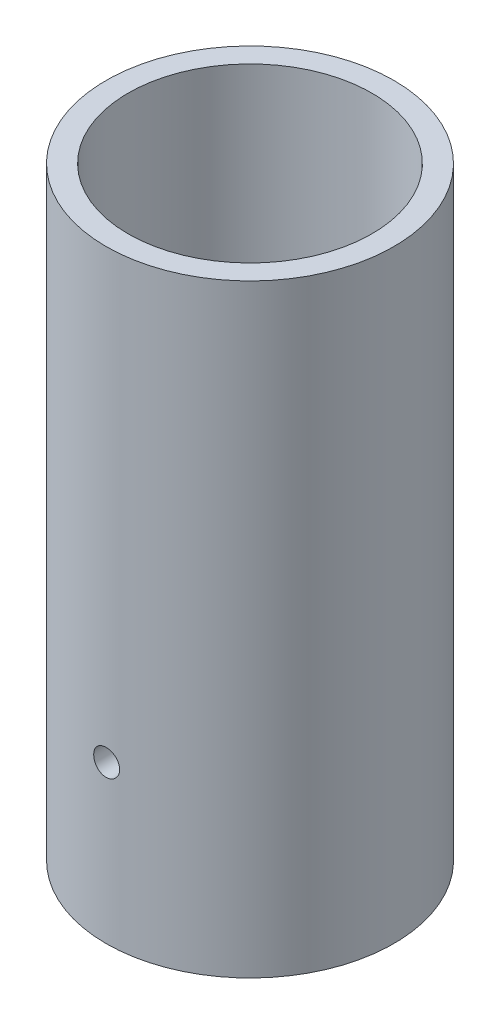
ISO-10303-21;
HEADER;
FILE_DESCRIPTION(('STEP AP214'),'2;1');
FILE_NAME('part.step','',(''),(''),'','','');
FILE_SCHEMA(('AUTOMOTIVE_DESIGN { 1 0 10303 214 1 1 1 1 }'));
ENDSEC;
DATA;
#1=APPLICATION_CONTEXT('core data for automotive mechanical design processes');
#2=APPLICATION_PROTOCOL_DEFINITION('international standard','automotive_design',2000,#1);
#3=PRODUCT_CONTEXT('',#1,'mechanical');
#4=PRODUCT('Part','Part','',(#3));
#5=PRODUCT_RELATED_PRODUCT_CATEGORY('part','',(#4));
#6=PRODUCT_DEFINITION_FORMATION('','',#4);
#7=PRODUCT_DEFINITION_CONTEXT('part definition',#1,'design');
#8=PRODUCT_DEFINITION('design','',#6,#7);
#9=PRODUCT_DEFINITION_SHAPE('','',#8);
#10=(LENGTH_UNIT() NAMED_UNIT(*) SI_UNIT(.MILLI.,.METRE.));
#11=(NAMED_UNIT(*) PLANE_ANGLE_UNIT() SI_UNIT($,.RADIAN.));
#12=(NAMED_UNIT(*) SI_UNIT($,.STERADIAN.) SOLID_ANGLE_UNIT());
#13=UNCERTAINTY_MEASURE_WITH_UNIT(LENGTH_MEASURE(1.E-05),#10,'distance_accuracy_value','');
#14=(GEOMETRIC_REPRESENTATION_CONTEXT(3) GLOBAL_UNCERTAINTY_ASSIGNED_CONTEXT((#13)) GLOBAL_UNIT_ASSIGNED_CONTEXT((#10,
#11,#12)) REPRESENTATION_CONTEXT('',''));
#15=CARTESIAN_POINT('',(0.,0.,0.));
#16=DIRECTION('',(0.,0.,1.));
#17=DIRECTION('',(1.,0.,0.));
#18=AXIS2_PLACEMENT_3D('',#15,#16,#17);
#19=CARTESIAN_POINT('',(0.,127.,0.));
#20=DIRECTION('',(0.,1.,0.));
#21=DIRECTION('',(0.,0.,1.));
#22=AXIS2_PLACEMENT_3D('',#19,#20,#21);
#23=PLANE('',#22);
#24=CARTESIAN_POINT('',(0.,127.,0.));
#25=DIRECTION('',(0.,1.,0.));
#26=DIRECTION('',(0.,0.,1.));
#27=AXIS2_PLACEMENT_3D('',#24,#25,#26);
#28=CIRCLE('',#27,30.275);
#29=CARTESIAN_POINT('',(0.,127.,30.275));
#30=VERTEX_POINT('',#29);
#31=EDGE_CURVE('E10',#30,#30,#28,.T.);
#32=ORIENTED_EDGE('',*,*,#31,.T.);
#33=EDGE_LOOP('',(#32));
#34=FACE_BOUND('',#33,.T.);
#35=CARTESIAN_POINT('',(0.,127.,0.));
#36=DIRECTION('',(0.,1.,0.));
#37=DIRECTION('',(0.,0.,1.));
#38=AXIS2_PLACEMENT_3D('',#35,#36,#37);
#39=CIRCLE('',#38,25.65);
#40=CARTESIAN_POINT('',(0.,127.,25.65));
#41=VERTEX_POINT('',#40);
#42=EDGE_CURVE('E50',#41,#41,#39,.T.);
#43=ORIENTED_EDGE('',*,*,#42,.F.);
#44=EDGE_LOOP('',(#43));
#45=FACE_BOUND('',#44,.T.);
#46=ADVANCED_FACE('F31',(#34,#45),#23,.T.);
#47=CARTESIAN_POINT('',(0.,0.,0.));
#48=DIRECTION('',(0.,1.,0.));
#49=DIRECTION('',(0.,0.,1.));
#50=AXIS2_PLACEMENT_3D('',#47,#48,#49);
#51=PLANE('',#50);
#52=CARTESIAN_POINT('',(0.,0.,0.));
#53=DIRECTION('',(0.,1.,0.));
#54=DIRECTION('',(0.,0.,1.));
#55=AXIS2_PLACEMENT_3D('',#52,#53,#54);
#56=CIRCLE('',#55,30.275);
#57=CARTESIAN_POINT('',(0.,0.,30.275));
#58=VERTEX_POINT('',#57);
#59=EDGE_CURVE('E45',#58,#58,#56,.T.);
#60=ORIENTED_EDGE('',*,*,#59,.F.);
#61=EDGE_LOOP('',(#60));
#62=FACE_BOUND('',#61,.T.);
#63=CARTESIAN_POINT('',(0.,0.,0.));
#64=DIRECTION('',(0.,1.,0.));
#65=DIRECTION('',(0.,0.,1.));
#66=AXIS2_PLACEMENT_3D('',#63,#64,#65);
#67=CIRCLE('',#66,25.65);
#68=CARTESIAN_POINT('',(0.,0.,25.65));
#69=VERTEX_POINT('',#68);
#70=EDGE_CURVE('E53',#69,#69,#67,.T.);
#71=ORIENTED_EDGE('',*,*,#70,.T.);
#72=EDGE_LOOP('',(#71));
#73=FACE_BOUND('',#72,.T.);
#74=ADVANCED_FACE('F89',(#62,#73),#51,.F.);
#75=CARTESIAN_POINT('',(0.,127.,0.));
#76=DIRECTION('',(0.,-1.,0.));
#77=DIRECTION('',(0.,0.,-1.));
#78=AXIS2_PLACEMENT_3D('',#75,#76,#77);
#79=CYLINDRICAL_SURFACE('',#78,30.275);
#80=CARTESIAN_POINT('',(0.,35.7505,-30.275));
#81=CARTESIAN_POINT('',(-0.153039796532041,35.7504933369597,-30.274998396495));
#82=CARTESIAN_POINT('',(-0.306182608367025,35.7375902820277,-30.273827223202));
#83=CARTESIAN_POINT('',(-0.608227744258544,35.6863093076183,-30.2692677906308));
#84=CARTESIAN_POINT('',(-0.757125120375373,35.6479028364442,-30.2658770465494));
#85=CARTESIAN_POINT('',(-1.04626135793968,35.5467376193578,-30.2572614808971));
#86=CARTESIAN_POINT('',(-1.18650519276836,35.4839930150886,-30.2520377245635));
#87=CARTESIAN_POINT('',(-1.45443817059843,35.3359587786664,-30.2403412842109));
#88=CARTESIAN_POINT('',(-1.58212991774405,35.250673836491,-30.2338688600783));
#89=CARTESIAN_POINT('',(-1.82174415771149,35.0597081642892,-30.2203794729355));
#90=CARTESIAN_POINT('',(-1.93362435688611,34.9539744593509,-30.213361124505));
#91=CARTESIAN_POINT('',(-2.13807648094813,34.7252250800091,-30.1995824581033));
#92=CARTESIAN_POINT('',(-2.23064754051271,34.6022086315072,-30.1928221517072));
#93=CARTESIAN_POINT('',(-2.39399967841389,34.3421259164146,-30.1803104339744));
#94=CARTESIAN_POINT('',(-2.46474311064646,34.2050359137305,-30.1745607729637));
#95=CARTESIAN_POINT('',(-2.58219141862255,33.9208626593836,-30.1647377967533));
#96=CARTESIAN_POINT('',(-2.62889678462727,33.7737796116002,-30.1606644473653));
#97=CARTESIAN_POINT('',(-2.69681931171527,33.4742225567922,-30.1546673348799));
#98=CARTESIAN_POINT('',(-2.71810593000487,33.3217644179107,-30.1527377150119));
#99=CARTESIAN_POINT('',(-2.73480133851506,33.0154279793044,-30.1512281774975));
#100=CARTESIAN_POINT('',(-2.73021069003373,32.8615497104556,-30.1516482088853));
#101=CARTESIAN_POINT('',(-2.69533921737893,32.5572181266144,-30.1547851813465));
#102=CARTESIAN_POINT('',(-2.66513401532401,32.4067560670952,-30.1574953611074));
#103=CARTESIAN_POINT('',(-2.5800084072271,32.113045930284,-30.1648966753623));
#104=CARTESIAN_POINT('',(-2.5250877236289,31.9697979340265,-30.1695878321028));
#105=CARTESIAN_POINT('',(-2.39200594589701,31.6943420330341,-30.1804303103077));
#106=CARTESIAN_POINT('',(-2.31381107061087,31.5621505359076,-30.1865837515585));
#107=CARTESIAN_POINT('',(-2.13642489553314,31.3127395377715,-30.199655573848));
#108=CARTESIAN_POINT('',(-2.03723309668703,31.1955203927308,-30.2065739730663));
#109=CARTESIAN_POINT('',(-1.82024531370444,30.9789419204139,-30.2204262856132));
#110=CARTESIAN_POINT('',(-1.70238397940709,30.879648052903,-30.2273601657782));
#111=CARTESIAN_POINT('',(-1.4516303479745,30.7022453285119,-30.2404386500661));
#112=CARTESIAN_POINT('',(-1.31873803838321,30.6241364891879,-30.246583253535));
#113=CARTESIAN_POINT('',(-1.04165113910215,30.4913245546243,-30.257392342497));
#114=CARTESIAN_POINT('',(-0.897455072976002,30.4366245229655,-30.2620566342368));
#115=CARTESIAN_POINT('',(-0.601874108097785,30.3522296014332,-30.2693774476558));
#116=CARTESIAN_POINT('',(-0.45048938422894,30.3225341035869,-30.2720340181518));
#117=CARTESIAN_POINT('',(-0.145395554745594,30.2890736458332,-30.2750338006882));
#118=CARTESIAN_POINT('',(0.00830356242745016,30.2852183031316,-30.2753850760197));
#119=CARTESIAN_POINT('',(0.314161467287707,30.3033105830662,-30.2737562581453));
#120=CARTESIAN_POINT('',(0.466320271826395,30.325257923105,-30.2717761904729));
#121=CARTESIAN_POINT('',(0.764519379329653,30.3942576237974,-30.2657124737368));
#122=CARTESIAN_POINT('',(0.910569492118686,30.4412679247775,-30.2616323493013));
#123=CARTESIAN_POINT('',(1.19270967265443,30.5590160360917,-30.251826622739));
#124=CARTESIAN_POINT('',(1.32879955694925,30.6297542833237,-30.2461009903141));
#125=CARTESIAN_POINT('',(1.58756646785721,30.7931762580891,-30.2336254431833));
#126=CARTESIAN_POINT('',(1.71020566562075,30.8859196702897,-30.226872761009));
#127=CARTESIAN_POINT('',(1.9382076536859,31.0906333629662,-30.2131105304041));
#128=CARTESIAN_POINT('',(2.0435700920798,31.2026040349842,-30.206100976745));
#129=CARTESIAN_POINT('',(2.23433921754917,31.4429868657648,-30.1925909972987));
#130=CARTESIAN_POINT('',(2.31968679173249,31.5714460357799,-30.1860921164267));
#131=CARTESIAN_POINT('',(2.46759776049845,31.8409262097638,-30.174361879898));
#132=CARTESIAN_POINT('',(2.53016141572134,31.9819470700082,-30.1691305097416));
#133=CARTESIAN_POINT('',(2.63062857284694,32.2723408184276,-30.1605367083578));
#134=CARTESIAN_POINT('',(2.66856786516479,32.4217012406999,-30.1571715656927));
#135=CARTESIAN_POINT('',(2.71882571401491,32.7247040955576,-30.1526824422984));
#136=CARTESIAN_POINT('',(2.73114485665157,32.8783464301055,-30.1515584103));
#137=CARTESIAN_POINT('',(2.72980541846368,33.1849642920234,-30.1516796628114));
#138=CARTESIAN_POINT('',(2.71623970692789,33.3379402369707,-30.1529164771184));
#139=CARTESIAN_POINT('',(2.66370970934868,33.6394312359827,-30.1576020442243));
#140=CARTESIAN_POINT('',(2.6247453881929,33.7879462838802,-30.1610508000811));
#141=CARTESIAN_POINT('',(2.52254859608507,34.0763030519945,-30.1697693886303));
#142=CARTESIAN_POINT('',(2.45931822182215,34.2161455203464,-30.1750390639837));
#143=CARTESIAN_POINT('',(2.31039421290795,34.4832461939319,-30.1868060314699));
#144=CARTESIAN_POINT('',(2.22470084207047,34.6105045469339,-30.193303309185));
#145=CARTESIAN_POINT('',(2.03293418907615,34.8493003046545,-30.2068212260521));
#146=CARTESIAN_POINT('',(1.92679191312628,34.9607822064388,-30.2138435862857));
#147=CARTESIAN_POINT('',(1.69727112285713,35.1643968729838,-30.2276046681862));
#148=CARTESIAN_POINT('',(1.57388846097051,35.2565249683546,-30.2343433210916));
#149=CARTESIAN_POINT('',(1.31311230981457,35.4189628909304,-30.2467919739262));
#150=CARTESIAN_POINT('',(1.17568975748844,35.489226189899,-30.2524997695156));
#151=CARTESIAN_POINT('',(0.891037250643065,35.6055893915586,-30.2622186027141));
#152=CARTESIAN_POINT('',(0.74381870326016,35.6517168632848,-30.2662315752117));
#153=CARTESIAN_POINT('',(0.496454227602007,35.7068467178444,-30.2710869066552));
#154=CARTESIAN_POINT('',(0.397895555760931,35.7231947048215,-30.272547573359));
#155=CARTESIAN_POINT('',(0.199572525116694,35.7450235012138,-30.2745046413668));
#156=CARTESIAN_POINT('',(0.0998081701771874,35.7505043454439,-30.27500104576));
#157=CARTESIAN_POINT('',(0.,35.7505,-30.275));
#158=B_SPLINE_CURVE_WITH_KNOTS('',3,(#80,#81,#82,#83,#84,#85,#86,#87,#88,#89,#90,#91,#92,#93,
#94,#95,#96,#97,#98,#99,#100,#101,#102,#103,#104,#105,#106,#107,#108,#109,#110,#111,#112,#113,
#114,#115,#116,#117,#118,#119,#120,#121,#122,#123,#124,#125,#126,#127,#128,#129,#130,#131,#132,
#133,#134,#135,#136,#137,#138,#139,#140,#141,#142,#143,#144,#145,#146,#147,#148,#149,#150,#151,
#152,#153,#154,#155,#156,#157),.UNSPECIFIED.,.T.,.F.,(4,2,2,2,2,2,2,2,2,2,2,2,2,2,2,2,2,2,2,2,2,
2,2,2,2,2,2,2,2,2,2,2,2,2,2,2,2,2,4),(0.,0.458754960194627,0.918024375588516,1.37702733181914,
1.83593485819636,2.29604756056633,2.75618087807162,3.21710340775988,3.67801653646771,
4.13766730810027,4.59730810958775,5.05559661409462,5.51389026533463,5.97285237444399,
6.43182539338183,6.8924420092035,7.35305900673729,7.8137362681713,8.27440232814132,
8.73345624170096,9.19250512763546,9.65078606954627,10.109075450155,10.5686223533406,
11.0281786158052,11.4890755256046,11.9499671627349,12.4101874053042,12.8703971194387,
13.3289588041651,13.7875211228321,14.246043828702,14.7045611497518,15.1646534757845,
15.6248566786795,16.086032599817,16.5466805885914,16.8458683872136,17.1450552273317),.UNSPECIFIED.);
#159=CARTESIAN_POINT('',(0.,35.7505,-30.275));
#160=VERTEX_POINT('',#159);
#161=EDGE_CURVE('E78',#160,#160,#158,.T.);
#162=ORIENTED_EDGE('',*,*,#161,.T.);
#163=EDGE_LOOP('',(#162));
#164=FACE_BOUND('',#163,.T.);
#165=CARTESIAN_POINT('',(2.7305,33.02,30.1516167850084));
#166=CARTESIAN_POINT('',(2.73049333567743,32.8669616307969,30.1516184129602));
#167=CARTESIAN_POINT('',(2.71759051329057,32.7138202417118,30.1527944824568));
#168=CARTESIAN_POINT('',(2.66631054655139,32.4117780619541,30.1573714064565));
#169=CARTESIAN_POINT('',(2.62790484558997,32.262882220338,30.1607747548724));
#170=CARTESIAN_POINT('',(2.52674188168898,31.9737492272656,30.1694176626406));
#171=CARTESIAN_POINT('',(2.46399879704276,31.8335070894337,30.1746561527178));
#172=CARTESIAN_POINT('',(2.31596813905167,31.5655769541271,30.1863777690424));
#173=CARTESIAN_POINT('',(2.23068525194452,31.437886354631,30.1928606364954));
#174=CARTESIAN_POINT('',(2.03972165413708,31.1982708150799,30.2063622457376));
#175=CARTESIAN_POINT('',(1.93398750954522,31.0863885330541,30.2133823615288));
#176=CARTESIAN_POINT('',(1.70523637685698,30.8819323901108,30.2271549418626));
#177=CARTESIAN_POINT('',(1.58221862034006,30.789359388129,30.233907394488));
#178=CARTESIAN_POINT('',(1.32213476284458,30.6260052219097,30.2463970970258));
#179=CARTESIAN_POINT('',(1.18504515067652,30.5552613462344,30.2521326027576));
#180=CARTESIAN_POINT('',(0.900872745212153,30.4378121106447,30.2619273051449));
#181=CARTESIAN_POINT('',(0.753790153598353,30.3911062657476,30.26598653562));
#182=CARTESIAN_POINT('',(0.454234480503325,30.3231827337157,30.2719617011353));
#183=CARTESIAN_POINT('',(0.301777275838107,30.3018955489415,30.2738834792324));
#184=CARTESIAN_POINT('',(-0.00455733469498665,30.2851986837977,30.2753870391388));
#185=CARTESIAN_POINT('',(-0.158434710021803,30.2897884482276,30.2749688711527));
#186=CARTESIAN_POINT('',(-0.462770201580873,30.3246585245451,30.2718444604031));
#187=CARTESIAN_POINT('',(-0.613236958324659,30.3548641041311,30.2691448735949));
#188=CARTESIAN_POINT('',(-0.90695629478235,30.4399920967701,30.2617688191317));
#189=CARTESIAN_POINT('',(-1.05020879594906,30.4949147788728,30.2570923299579));
#190=CARTESIAN_POINT('',(-1.32567014492829,30.6280006877968,30.2462769924241));
#191=CARTESIAN_POINT('',(-1.45786281207177,30.7061972283483,30.2401360503974));
#192=CARTESIAN_POINT('',(-1.70727544333696,30.8835869539408,30.2270815128061));
#193=CARTESIAN_POINT('',(-1.8244950508418,30.9827806389263,30.2201678988459));
#194=CARTESIAN_POINT('',(-2.04107138022298,31.1997697555965,30.2063155046362));
#195=CARTESIAN_POINT('',(-2.14036302352766,31.3176301534154,30.1993767224164));
#196=CARTESIAN_POINT('',(-2.31776170710555,31.568381120207,30.1862807130055));
#197=CARTESIAN_POINT('',(-2.3958687252532,31.7012717048773,30.1801234866307));
#198=CARTESIAN_POINT('',(-2.52867935130964,31.9783581457721,30.1692868356647));
#199=CARTESIAN_POINT('',(-2.5833793316646,32.1225557502307,30.1646076401638));
#200=CARTESIAN_POINT('',(-2.66777367879284,32.4181400575422,30.1572614629873));
#201=CARTESIAN_POINT('',(-2.69746866281903,32.5695265828377,30.1545944316411));
#202=CARTESIAN_POINT('',(-2.73092718385411,32.8746212361768,30.151582851419));
#203=CARTESIAN_POINT('',(-2.73478158740055,33.0283193222624,30.1512301644109));
#204=CARTESIAN_POINT('',(-2.71668779722003,33.3341749390098,30.1528657295729));
#205=CARTESIAN_POINT('',(-2.69473988609089,33.4863324865258,30.1548539561043));
#206=CARTESIAN_POINT('',(-2.62574034555177,33.7845254130284,30.1609399137801));
#207=CARTESIAN_POINT('',(-2.57873133941329,33.930570734034,30.1650340628109));
#208=CARTESIAN_POINT('',(-2.46098742348929,34.2127019042347,30.1748676177527));
#209=CARTESIAN_POINT('',(-2.39025206918499,34.348787566775,30.1806070544883));
#210=CARTESIAN_POINT('',(-2.22683434049392,34.6075516223351,30.1931042195118));
#211=CARTESIAN_POINT('',(-2.13409154620172,34.7301917217405,30.199864732182));
#212=CARTESIAN_POINT('',(-1.9293785677535,34.9581958170262,30.2136330199672));
#213=CARTESIAN_POINT('',(-1.81740799640865,35.0635594649278,30.2206408000591));
#214=CARTESIAN_POINT('',(-1.57702463320707,35.2543311738754,30.2341383913645));
#215=CARTESIAN_POINT('',(-1.44856481309688,35.339680103139,30.2406266313603));
#216=CARTESIAN_POINT('',(-1.17908298045684,35.4875934500487,30.2523313644386));
#217=CARTESIAN_POINT('',(-1.03806111183453,35.5501581286635,30.257547872087));
#218=CARTESIAN_POINT('',(-0.747668024397001,35.6506259691979,30.2661142077128));
#219=CARTESIAN_POINT('',(-0.598309425581182,35.6885653648652,30.2694667772492));
#220=CARTESIAN_POINT('',(-0.295310413993979,35.738824038396,30.2739386735834));
#221=CARTESIAN_POINT('',(-0.14167009763017,35.7511438926401,30.2750580506227));
#222=CARTESIAN_POINT('',(0.16494900964008,35.7498065176679,30.2749374768306));
#223=CARTESIAN_POINT('',(0.317928213544625,35.7362413014594,30.2737058829307));
#224=CARTESIAN_POINT('',(0.619425853419593,35.6837111475077,30.2690382517232));
#225=CARTESIAN_POINT('',(0.767944284237614,35.6447461804279,30.2656022118694));
#226=CARTESIAN_POINT('',(1.05630778805069,35.5425468340385,30.2569109908534));
#227=CARTESIAN_POINT('',(1.19615360047093,35.4793145270696,30.2516559650296));
#228=CARTESIAN_POINT('',(1.46326015477982,35.3303856184714,30.2399138483672));
#229=CARTESIAN_POINT('',(1.5905210465064,35.2446892843465,30.2334267722004));
#230=CARTESIAN_POINT('',(1.82931662309615,35.0529193859789,30.2199206178122));
#231=CARTESIAN_POINT('',(1.94079634669324,34.9467775047179,30.2128998051561));
#232=CARTESIAN_POINT('',(2.14440680303768,34.7172583981351,30.1991322351751));
#233=CARTESIAN_POINT('',(2.23653286070811,34.5938770203934,30.1923855443838));
#234=CARTESIAN_POINT('',(2.39896860620941,34.3331019016457,30.179914612841));
#235=CARTESIAN_POINT('',(2.46923139558876,34.1956788670202,30.1741925810669));
#236=CARTESIAN_POINT('',(2.58559351065921,33.9110253343394,30.1644454984251));
#237=CARTESIAN_POINT('',(2.63172041253157,33.7638062464718,30.1604185119365));
#238=CARTESIAN_POINT('',(2.68684865076444,33.5164432973271,30.1555453282406));
#239=CARTESIAN_POINT('',(2.70319591040544,33.4178868068049,30.1540789721716));
#240=CARTESIAN_POINT('',(2.7250237404793,33.2195681469359,30.1521141712831));
#241=CARTESIAN_POINT('',(2.73050434622545,33.1198059815084,30.1516157233182));
#242=CARTESIAN_POINT('',(2.7305,33.02,30.1516167850084));
#243=B_SPLINE_CURVE_WITH_KNOTS('',3,(#165,#166,#167,#168,#169,#170,#171,#172,#173,#174,#175,
#176,#177,#178,#179,#180,#181,#182,#183,#184,#185,#186,#187,#188,#189,#190,#191,#192,#193,#194,
#195,#196,#197,#198,#199,#200,#201,#202,#203,#204,#205,#206,#207,#208,#209,#210,#211,#212,#213,
#214,#215,#216,#217,#218,#219,#220,#221,#222,#223,#224,#225,#226,#227,#228,#229,#230,#231,#232,
#233,#234,#235,#236,#237,#238,#239,#240,#241,#242),.UNSPECIFIED.,.T.,.F.,(4,2,2,2,2,2,2,2,2,2,2,
2,2,2,2,2,2,2,2,2,2,2,2,2,2,2,2,2,2,2,2,2,2,2,2,2,2,2,4),(0.,0.458750673007824,0.91801589593558,
1.37701396439172,1.83591667778451,2.29603499004702,2.75617376541172,3.21709425428678,
3.67800544343279,4.13765353981234,4.59729177429227,5.05559364214736,5.51390049881191,
5.97286654762951,6.43184352571144,6.89245448894514,7.35306593324631,7.81374873592342,
8.27442016622799,8.73347082510538,9.19251645631326,9.65078383357536,10.1090597970657,
10.5686087867269,11.0281670313898,11.489066361681,11.9499604127092,12.4101747555826,
12.870378744583,13.3289499049169,13.7875215949017,14.2460541332785,14.7045812116415,
15.1646678631653,15.6248655258781,16.0860436503333,16.5466937040937,16.8458749500581,
17.1450552237739),.UNSPECIFIED.);
#244=CARTESIAN_POINT('',(2.7305,33.02,30.1516167850084));
#245=VERTEX_POINT('',#244);
#246=EDGE_CURVE('E73',#245,#245,#243,.T.);
#247=ORIENTED_EDGE('',*,*,#246,.T.);
#248=EDGE_LOOP('',(#247));
#249=FACE_BOUND('',#248,.T.);
#250=ORIENTED_EDGE('',*,*,#31,.F.);
#251=EDGE_LOOP('',(#250));
#252=FACE_BOUND('',#251,.T.);
#253=ORIENTED_EDGE('',*,*,#59,.T.);
#254=EDGE_LOOP('',(#253));
#255=FACE_BOUND('',#254,.T.);
#256=ADVANCED_FACE('F33',(#164,#249,#252,#255),#79,.T.);
#257=CARTESIAN_POINT('',(0.,127.,0.));
#258=DIRECTION('',(0.,-1.,0.));
#259=DIRECTION('',(0.,0.,-1.));
#260=AXIS2_PLACEMENT_3D('',#257,#258,#259);
#261=CYLINDRICAL_SURFACE('',#260,25.65);
#262=CARTESIAN_POINT('',(0.,35.7505,-25.65));
#263=CARTESIAN_POINT('',(-0.152909225031215,35.7504934057414,-25.6499981393499));
#264=CARTESIAN_POINT('',(-0.30591823490084,35.7376122617194,-25.6486181683737));
#265=CARTESIAN_POINT('',(-0.60769052279372,35.6864234103468,-25.6432458958048));
#266=CARTESIAN_POINT('',(-0.7564489971602,35.6480880365203,-25.6392507518194));
#267=CARTESIAN_POINT('',(-1.04530683653449,35.5471226221913,-25.6290988989986));
#268=CARTESIAN_POINT('',(-1.18541151162097,35.4845076551361,-25.6229435315146));
#269=CARTESIAN_POINT('',(-1.45309328346652,35.3367906460925,-25.609158635358));
#270=CARTESIAN_POINT('',(-1.58067278331033,35.2516929292625,-25.6015293903011));
#271=CARTESIAN_POINT('',(-1.8202292543635,35.0610563757707,-25.5856161219789));
#272=CARTESIAN_POINT('',(-1.93214828826995,34.9554449162106,-25.5773298362205));
#273=CARTESIAN_POINT('',(-2.13670862386978,34.7269340356074,-25.5610549980247));
#274=CARTESIAN_POINT('',(-2.22934901332522,34.604033796945,-25.5530664596909));
#275=CARTESIAN_POINT('',(-2.39293037744454,34.3440677081908,-25.5382687489029));
#276=CARTESIAN_POINT('',(-2.46381843470266,34.2069683814636,-25.5314624697243));
#277=CARTESIAN_POINT('',(-2.58154499035395,33.9227275077011,-25.5198284829808));
#278=CARTESIAN_POINT('',(-2.62838415750353,33.7755862400429,-25.5150007203974));
#279=CARTESIAN_POINT('',(-2.6965104242325,33.4760321144936,-25.5078911774193));
#280=CARTESIAN_POINT('',(-2.71789410374405,33.3236414535509,-25.5055997762266));
#281=CARTESIAN_POINT('',(-2.73480101152096,33.0174183080265,-25.5037926532757));
#282=CARTESIAN_POINT('',(-2.73032500452895,32.8635858662166,-25.5042768494354));
#283=CARTESIAN_POINT('',(-2.69571912034925,32.5595133781463,-25.5079574206654));
#284=CARTESIAN_POINT('',(-2.66569491451172,32.4092611513521,-25.5111426237614));
#285=CARTESIAN_POINT('',(-2.58100943906104,32.115940371545,-25.5198488761223));
#286=CARTESIAN_POINT('',(-2.52634779685059,31.9728719272104,-25.5253699607133));
#287=CARTESIAN_POINT('',(-2.39382317947822,31.6976473994652,-25.5381387073327));
#288=CARTESIAN_POINT('',(-2.31591355039724,31.5655139479341,-25.5453898352808));
#289=CARTESIAN_POINT('',(-2.13913801410159,31.3161579250712,-25.5607987877791));
#290=CARTESIAN_POINT('',(-2.04027141147026,31.198935848751,-25.568956642413));
#291=CARTESIAN_POINT('',(-1.82379926935221,30.9821161926076,-25.5853096291961));
#292=CARTESIAN_POINT('',(-1.70610251095145,30.8826096614715,-25.5935047437968));
#293=CARTESIAN_POINT('',(-1.4556271474302,30.70475218039,-25.6089704461548));
#294=CARTESIAN_POINT('',(-1.32284852179127,30.6264012592267,-25.6162410326543));
#295=CARTESIAN_POINT('',(-1.04591374765408,30.4930818663559,-25.6290413385283));
#296=CARTESIAN_POINT('',(-0.901755234140786,30.4381182703454,-25.6345706948356));
#297=CARTESIAN_POINT('',(-0.60618369212013,30.3532017818208,-25.6432619446089));
#298=CARTESIAN_POINT('',(-0.45477090973737,30.3232480414006,-25.6464239183356));
#299=CARTESIAN_POINT('',(-0.149777071911533,30.2893176391701,-25.6500137974812));
#300=CARTESIAN_POINT('',(0.00378986268506401,30.2852153887659,-25.6504549207854));
#301=CARTESIAN_POINT('',(0.309424633684784,30.3027741857781,-25.6485888975874));
#302=CARTESIAN_POINT('',(0.461492493053614,30.3244348378886,-25.646281793254));
#303=CARTESIAN_POINT('',(0.759448063264611,30.3928003465771,-25.6391869499922));
#304=CARTESIAN_POINT('',(0.905349476412655,30.4394461433705,-25.6344050618452));
#305=CARTESIAN_POINT('',(1.18725712183713,30.5563969771264,-25.622896833893));
#306=CARTESIAN_POINT('',(1.32326310439766,30.6267026109044,-25.6161704450388));
#307=CARTESIAN_POINT('',(1.58208536869978,30.7892870534469,-25.6014920423573));
#308=CARTESIAN_POINT('',(1.7048497452982,30.8816480742382,-25.5935354831214));
#309=CARTESIAN_POINT('',(1.93317792324131,31.0856039980092,-25.5773034263321));
#310=CARTESIAN_POINT('',(2.03874123397707,31.1971994494068,-25.5690279196899));
#311=CARTESIAN_POINT('',(2.23010905666173,31.4370056979416,-25.5530506527936));
#312=CARTESIAN_POINT('',(2.31583094499098,31.5652826187625,-25.5453513789724));
#313=CARTESIAN_POINT('',(2.46451394101447,31.8344856166238,-25.531436918617));
#314=CARTESIAN_POINT('',(2.52747539545585,31.9754115009208,-25.525221709474));
#315=CARTESIAN_POINT('',(2.62871303112183,32.265632689542,-25.5149949911557));
#316=CARTESIAN_POINT('',(2.66703775991761,32.414910900044,-25.5109791503718));
#317=CARTESIAN_POINT('',(2.7180713037567,32.717828733553,-25.5055926711157));
#318=CARTESIAN_POINT('',(2.73078096048771,32.8714682130845,-25.5042219457275));
#319=CARTESIAN_POINT('',(2.73021101262391,33.1779259565614,-25.5042829008755));
#320=CARTESIAN_POINT('',(2.71706119666807,33.3307444811652,-25.5057005863895));
#321=CARTESIAN_POINT('',(2.66541835243286,33.6319878221129,-25.5111487277371));
#322=CARTESIAN_POINT('',(2.62692530093359,33.780412634431,-25.5151791859646));
#323=CARTESIAN_POINT('',(2.52572564616468,34.0686504428852,-25.5253947550109));
#324=CARTESIAN_POINT('',(2.46302344732132,34.2084650001431,-25.5315794738802));
#325=CARTESIAN_POINT('',(2.31519853099339,34.4756068078741,-25.5454074650711));
#326=CARTESIAN_POINT('',(2.23007584159032,34.6029340739872,-25.5530507355659));
#327=CARTESIAN_POINT('',(2.03933991808278,34.8421519188331,-25.5689806113547));
#328=CARTESIAN_POINT('',(1.93362989482745,34.953965132641,-25.5772701400183));
#329=CARTESIAN_POINT('',(1.70491522552562,35.1583205163496,-25.5935319779293));
#330=CARTESIAN_POINT('',(1.58190645965217,35.2508580825443,-25.6015042110284));
#331=CARTESIAN_POINT('',(1.32170181589374,35.4142451829965,-25.6162569568079));
#332=CARTESIAN_POINT('',(1.18446699486571,35.4850329631418,-25.623034053347));
#333=CARTESIAN_POINT('',(0.900071504346655,35.6024634787954,-25.6345965926099));
#334=CARTESIAN_POINT('',(0.752922139809138,35.6491332051221,-25.6393842605472));
#335=CARTESIAN_POINT('',(0.504130005636024,35.7054752329865,-25.6452370067103));
#336=CARTESIAN_POINT('',(0.404072933784929,35.7223361716963,-25.6470147128267));
#337=CARTESIAN_POINT('',(0.202691854822198,35.744850713911,-25.6493968233783));
#338=CARTESIAN_POINT('',(0.101367853829221,35.7505043715206,-25.6500012334776));
#339=CARTESIAN_POINT('',(0.,35.7505,-25.65));
#340=B_SPLINE_CURVE_WITH_KNOTS('',3,(#262,#263,#264,#265,#266,#267,#268,#269,#270,#271,#272,
#273,#274,#275,#276,#277,#278,#279,#280,#281,#282,#283,#284,#285,#286,#287,#288,#289,#290,#291,
#292,#293,#294,#295,#296,#297,#298,#299,#300,#301,#302,#303,#304,#305,#306,#307,#308,#309,#310,
#311,#312,#313,#314,#315,#316,#317,#318,#319,#320,#321,#322,#323,#324,#325,#326,#327,#328,#329,
#330,#331,#332,#333,#334,#335,#336,#337,#338,#339),.UNSPECIFIED.,.T.,.F.,(4,2,2,2,2,2,2,2,2,2,2,
2,2,2,2,2,2,2,2,2,2,2,2,2,2,2,2,2,2,2,2,2,2,2,2,2,2,2,4),(0.,0.458357492894157,
0.917213996775852,1.37578608468924,1.83427001814463,2.29440767860582,2.75456710717598,
3.21583726017132,3.67709458537771,4.1365962323289,4.59608429061154,5.05368102110024,
5.51128467215598,5.96981288704786,6.4283563196948,6.88919236345614,7.35002903417933,
7.81096173129469,8.27187880083225,8.7305549612818,9.18922408389637,9.64681376025358,
10.1044149801017,10.5637493042084,11.0230967271598,11.4843238668983,11.9455439797087,
12.4058524326278,12.866145759988,13.3241347717189,13.7821242030675,14.2400303505702,
14.6979359245516,15.1580486576355,15.6182711562211,16.079788539029,16.5407883072874,
16.8446479314457,17.1485060886742),.UNSPECIFIED.);
#341=CARTESIAN_POINT('',(0.,35.7505,-25.65));
#342=VERTEX_POINT('',#341);
#343=EDGE_CURVE('E36',#342,#342,#340,.T.);
#344=ORIENTED_EDGE('',*,*,#343,.F.);
#345=EDGE_LOOP('',(#344));
#346=FACE_BOUND('',#345,.T.);
#347=CARTESIAN_POINT('',(2.7305,33.02,25.5042519935402));
#348=CARTESIAN_POINT('',(2.73049340327472,32.8670935426254,25.5042538936172));
#349=CARTESIAN_POINT('',(2.7176127097928,32.7140872918458,25.50564190628));
#350=CARTESIAN_POINT('',(2.66642581064853,32.4123207364809,25.5110429052002));
#351=CARTESIAN_POINT('',(2.62809192889115,32.263565237723,25.5150587487163));
#352=CARTESIAN_POINT('',(2.52713087916848,31.974713690822,25.525255492264));
#353=CARTESIAN_POINT('',(2.46451885554695,31.834612307406,25.5314350423748));
#354=CARTESIAN_POINT('',(2.31680877848389,31.5669360528852,25.5452612688509));
#355=CARTESIAN_POINT('',(2.23171504299469,31.439358782782,25.5529076634093));
#356=CARTESIAN_POINT('',(2.04108251457213,31.1997998018131,25.5688411423417));
#357=CARTESIAN_POINT('',(1.93547020895113,31.0878767326357,25.5771304640101));
#358=CARTESIAN_POINT('',(1.70695594085479,30.8833086066406,25.5933955422758));
#359=CARTESIAN_POINT('',(1.58405317178335,30.7906644496798,25.6013712842224));
#360=CARTESIAN_POINT('',(1.3240848581216,30.6270791396424,25.6161328835028));
#361=CARTESIAN_POINT('',(1.18698627208971,30.5561902137536,25.6229158610017));
#362=CARTESIAN_POINT('',(0.902747007980331,30.4384618479713,25.6345032588114));
#363=CARTESIAN_POINT('',(0.755606605001103,30.3916217495532,25.6393077332985));
#364=CARTESIAN_POINT('',(0.456055158477484,30.3234935460586,25.6463810715177));
#365=CARTESIAN_POINT('',(0.303666329782627,30.3021087764787,25.648659525326));
#366=CARTESIAN_POINT('',(-0.00255322589063926,30.2851990537085,25.6504567526284));
#367=CARTESIAN_POINT('',(-0.156383910759781,30.2896733476416,25.6499756064671));
#368=CARTESIAN_POINT('',(-0.460463937834983,30.3242765137604,25.6463156731217));
#369=CARTESIAN_POINT('',(-0.61072525875184,30.354301439226,25.6431478163617));
#370=CARTESIAN_POINT('',(-0.904063855036552,30.4389915038879,25.6344829200905));
#371=CARTESIAN_POINT('',(-1.04714102649618,30.4936569993601,25.6289858469013));
#372=CARTESIAN_POINT('',(-1.32237615622921,30.6261896072332,25.6162616252393));
#373=CARTESIAN_POINT('',(-1.45451191755539,30.7041024765138,25.6090310703907));
#374=CARTESIAN_POINT('',(-1.70387118700394,30.8808849348458,25.5936506579751));
#375=CARTESIAN_POINT('',(-1.82109419895928,30.9797552208866,25.5855007698377));
#376=CARTESIAN_POINT('',(-2.03790971649073,31.1962299829124,25.5691479860408));
#377=CARTESIAN_POINT('',(-2.13741191645364,31.3139249239548,25.5609450279264));
#378=CARTESIAN_POINT('',(-2.31526152368376,31.5643951056029,25.5454508463344));
#379=CARTESIAN_POINT('',(-2.39360889315672,31.6971703731497,25.5381596244857));
#380=CARTESIAN_POINT('',(-2.52692572822411,31.9741042225937,25.5253140044379));
#381=CARTESIAN_POINT('',(-2.58188922393283,32.1182657002576,25.5197600498577));
#382=CARTESIAN_POINT('',(-2.66680460420847,32.4138436874759,25.5110268648745));
#383=CARTESIAN_POINT('',(-2.69675735475804,32.5652599456457,25.5078475522514));
#384=CARTESIAN_POINT('',(-2.73068402160188,32.8702554240264,25.504238075173));
#385=CARTESIAN_POINT('',(-2.73478445273861,33.0238204190605,25.5037945228176));
#386=CARTESIAN_POINT('',(-2.71722270946217,33.3294508744363,25.5056714413376));
#387=CARTESIAN_POINT('',(-2.69556093045629,33.4815163577569,25.5079918697906));
#388=CARTESIAN_POINT('',(-2.62719567594012,33.7794599881511,25.5151231094303));
#389=CARTESIAN_POINT('',(-2.5805523623369,33.9253520952743,25.5199279365938));
#390=CARTESIAN_POINT('',(-2.46360961007939,34.2072422266403,25.5314817405622));
#391=CARTESIAN_POINT('',(-2.3933095599366,34.3432399950197,25.538230767621));
#392=CARTESIAN_POINT('',(-2.23073335825278,34.6020566226371,25.5529448598376));
#393=CARTESIAN_POINT('',(-2.13837357668757,34.7248226847327,25.5609145101834));
#394=CARTESIAN_POINT('',(-1.93441914176642,34.953154840291,25.5771570166846));
#395=CARTESIAN_POINT('',(-1.82282394826393,35.0587204505886,25.5854298813495));
#396=CARTESIAN_POINT('',(-1.5830167042199,35.2500932994446,25.6013872639233));
#397=CARTESIAN_POINT('',(-1.45473848252744,35.3358178618824,25.6090692339721));
#398=CARTESIAN_POINT('',(-1.18553216442562,35.4845055488161,25.6229419594157));
#399=CARTESIAN_POINT('',(-1.04460426128228,35.5474690209897,25.629132737588));
#400=CARTESIAN_POINT('',(-0.754384300822082,35.6487079786654,25.6393140919184));
#401=CARTESIAN_POINT('',(-0.605109644356378,35.6870328860983,25.6433090702302));
#402=CARTESIAN_POINT('',(-0.302199311011301,35.7380679912872,25.6486668174409));
#403=CARTESIAN_POINT('',(-0.148563774351823,35.7507790116891,25.6500296708762));
#404=CARTESIAN_POINT('',(0.157896264892352,35.75021306583,25.6499694856079));
#405=CARTESIAN_POINT('',(0.310721022893725,35.7370642369976,25.648560183132));
#406=CARTESIAN_POINT('',(0.611977078498616,35.6854211753086,25.6431411750282));
#407=CARTESIAN_POINT('',(0.76040837397965,35.6469269302077,25.639131468144));
#408=CARTESIAN_POINT('',(1.04865926366913,35.5457224157833,25.6289606972223));
#409=CARTESIAN_POINT('',(1.18848039351411,35.4830164792413,25.6228000181291));
#410=CARTESIAN_POINT('',(1.45563378841004,35.335182050848,25.6090129519729));
#411=CARTESIAN_POINT('',(1.58296607318013,35.2500535944014,25.6013865672244));
#412=CARTESIAN_POINT('',(1.82218369452166,35.0593112989409,25.5854765484946));
#413=CARTESIAN_POINT('',(1.93399271458515,34.9536019917104,25.5771899621723));
#414=CARTESIAN_POINT('',(2.13833997123694,34.7248904840019,25.5609182010375));
#415=CARTESIAN_POINT('',(2.23087359309044,34.6018841542132,25.5529330987771));
#416=CARTESIAN_POINT('',(2.39425641486035,34.3416815242435,25.5381441318878));
#417=CARTESIAN_POINT('',(2.4650431609407,34.2044458415082,25.5313436932122));
#418=CARTESIAN_POINT('',(2.58247150514334,33.9200485292778,25.5197346089817));
#419=CARTESIAN_POINT('',(2.62914010771643,33.7728982106138,25.5149237369729));
#420=CARTESIAN_POINT('',(2.68547899230087,33.5241090785103,25.5090411245753));
#421=CARTESIAN_POINT('',(2.70233851611279,33.4240561848074,25.5072537988383));
#422=CARTESIAN_POINT('',(2.72485117888656,33.2226834747619,25.5048586064331));
#423=CARTESIAN_POINT('',(2.73050437305435,33.1213636646628,25.5042507339546));
#424=CARTESIAN_POINT('',(2.7305,33.02,25.5042519935402));
#425=B_SPLINE_CURVE_WITH_KNOTS('',3,(#347,#348,#349,#350,#351,#352,#353,#354,#355,#356,#357,
#358,#359,#360,#361,#362,#363,#364,#365,#366,#367,#368,#369,#370,#371,#372,#373,#374,#375,#376,
#377,#378,#379,#380,#381,#382,#383,#384,#385,#386,#387,#388,#389,#390,#391,#392,#393,#394,#395,
#396,#397,#398,#399,#400,#401,#402,#403,#404,#405,#406,#407,#408,#409,#410,#411,#412,#413,#414,
#415,#416,#417,#418,#419,#420,#421,#422,#423,#424),.UNSPECIFIED.,.T.,.F.,(4,2,2,2,2,2,2,2,2,2,2,
2,2,2,2,2,2,2,2,2,2,2,2,2,2,2,2,2,2,2,2,2,2,2,2,2,2,2,4),(0.,0.458349179223486,
0.917197554623116,1.37576016649003,1.83423476842752,2.29438330890616,2.75455332232944,
3.21581956414074,3.67707317450893,4.13656956707948,4.59605258165879,5.05367518565343,
5.51130440658492,5.96984037026856,6.42839158606666,6.88921659194003,7.35004242109657,
7.81098582825138,8.2719132748443,8.73058329456933,9.18924627455942,9.64680961137429,
10.1043847763725,10.5637229731989,11.0230740707299,11.4843061075662,11.9455310987465,
12.4058280186676,12.8661101549139,13.3241173055324,13.7821246774107,14.2400501249473,
14.6979748494346,15.158076656398,15.618288490334,16.0798098897958,16.5408134101601,
16.8446604953467,17.1485060836822),.UNSPECIFIED.);
#426=CARTESIAN_POINT('',(2.7305,33.02,25.5042519935402));
#427=VERTEX_POINT('',#426);
#428=EDGE_CURVE('E55',#427,#427,#425,.T.);
#429=ORIENTED_EDGE('',*,*,#428,.F.);
#430=EDGE_LOOP('',(#429));
#431=FACE_BOUND('',#430,.T.);
#432=ORIENTED_EDGE('',*,*,#42,.T.);
#433=EDGE_LOOP('',(#432));
#434=FACE_BOUND('',#433,.T.);
#435=ORIENTED_EDGE('',*,*,#70,.F.);
#436=EDGE_LOOP('',(#435));
#437=FACE_BOUND('',#436,.T.);
#438=ADVANCED_FACE('F60',(#346,#431,#434,#437),#261,.F.);
#439=CARTESIAN_POINT('',(0.,33.02,-30.275));
#440=DIRECTION('',(0.,0.,1.));
#441=DIRECTION('',(1.,0.,0.));
#442=AXIS2_PLACEMENT_3D('',#439,#440,#441);
#443=CYLINDRICAL_SURFACE('',#442,2.7305);
#444=ORIENTED_EDGE('',*,*,#428,.T.);
#445=EDGE_LOOP('',(#444));
#446=FACE_BOUND('',#445,.T.);
#447=ORIENTED_EDGE('',*,*,#246,.F.);
#448=EDGE_LOOP('',(#447));
#449=FACE_BOUND('',#448,.T.);
#450=ADVANCED_FACE('F66',(#446,#449),#443,.F.);
#451=ORIENTED_EDGE('',*,*,#343,.T.);
#452=EDGE_LOOP('',(#451));
#453=FACE_BOUND('',#452,.T.);
#454=ORIENTED_EDGE('',*,*,#161,.F.);
#455=EDGE_LOOP('',(#454));
#456=FACE_BOUND('',#455,.T.);
#457=ADVANCED_FACE('F63',(#453,#456),#443,.F.);
#458=CLOSED_SHELL('',(#46,#74,#256,#438,#450,#457));
#459=MANIFOLD_SOLID_BREP('B2',#458);
#460=ADVANCED_BREP_SHAPE_REPRESENTATION('',(#18,#459),#14);
#461=SHAPE_DEFINITION_REPRESENTATION(#9,#460);
ENDSEC;
END-ISO-10303-21;
